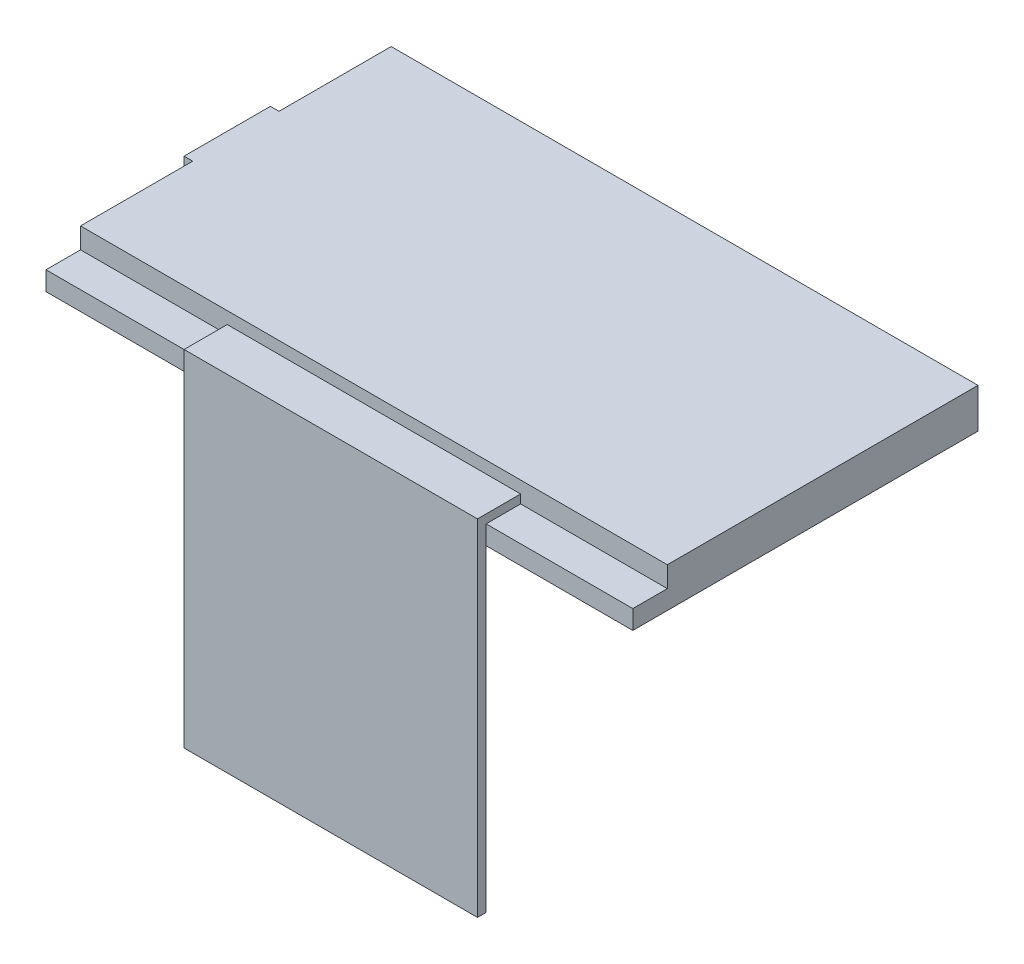
ISO-10303-21;
HEADER;
FILE_DESCRIPTION(('STEP AP214'),'2;1');
FILE_NAME('part.step','',(''),(''),'','','');
FILE_SCHEMA(('AUTOMOTIVE_DESIGN { 1 0 10303 214 1 1 1 1 }'));
ENDSEC;
DATA;
#1=APPLICATION_CONTEXT('core data for automotive mechanical design processes');
#2=APPLICATION_PROTOCOL_DEFINITION('international standard','automotive_design',2000,#1);
#3=PRODUCT_CONTEXT('',#1,'mechanical');
#4=PRODUCT('Part','Part','',(#3));
#5=PRODUCT_RELATED_PRODUCT_CATEGORY('part','',(#4));
#6=PRODUCT_DEFINITION_FORMATION('','',#4);
#7=PRODUCT_DEFINITION_CONTEXT('part definition',#1,'design');
#8=PRODUCT_DEFINITION('design','',#6,#7);
#9=PRODUCT_DEFINITION_SHAPE('','',#8);
#10=(LENGTH_UNIT() NAMED_UNIT(*) SI_UNIT(.MILLI.,.METRE.));
#11=(NAMED_UNIT(*) PLANE_ANGLE_UNIT() SI_UNIT($,.RADIAN.));
#12=(NAMED_UNIT(*) SI_UNIT($,.STERADIAN.) SOLID_ANGLE_UNIT());
#13=UNCERTAINTY_MEASURE_WITH_UNIT(LENGTH_MEASURE(1.E-05),#10,'distance_accuracy_value','');
#14=(GEOMETRIC_REPRESENTATION_CONTEXT(3) GLOBAL_UNCERTAINTY_ASSIGNED_CONTEXT((#13)) GLOBAL_UNIT_ASSIGNED_CONTEXT((#10,
#11,#12)) REPRESENTATION_CONTEXT('',''));
#15=CARTESIAN_POINT('',(0.,0.,0.));
#16=DIRECTION('',(0.,0.,1.));
#17=DIRECTION('',(1.,0.,0.));
#18=AXIS2_PLACEMENT_3D('',#15,#16,#17);
#19=CARTESIAN_POINT('',(-17.,1.1,10.));
#20=DIRECTION('',(0.,0.,-1.));
#21=DIRECTION('',(-1.,0.,0.));
#22=AXIS2_PLACEMENT_3D('',#19,#20,#21);
#23=PLANE('',#22);
#24=DIRECTION('',(0.,1.,0.));
#25=VECTOR('',#24,1.);
#26=CARTESIAN_POINT('',(8.5,-18.4,10.));
#27=LINE('',#26,#25);
#28=CARTESIAN_POINT('',(8.5,0.,10.));
#29=VERTEX_POINT('',#28);
#30=CARTESIAN_POINT('',(8.5,1.1,10.));
#31=VERTEX_POINT('',#30);
#32=EDGE_CURVE('E11',#29,#31,#27,.T.);
#33=ORIENTED_EDGE('',*,*,#32,.F.);
#34=DIRECTION('',(1.,0.,0.));
#35=VECTOR('',#34,1.);
#36=CARTESIAN_POINT('',(-17.,0.,10.));
#37=LINE('',#36,#35);
#38=CARTESIAN_POINT('',(17.,0.,10.));
#39=VERTEX_POINT('',#38);
#40=EDGE_CURVE('E276',#29,#39,#37,.T.);
#41=ORIENTED_EDGE('',*,*,#40,.T.);
#42=DIRECTION('',(0.,-1.,0.));
#43=VECTOR('',#42,1.);
#44=CARTESIAN_POINT('',(17.,1.1,10.));
#45=LINE('',#44,#43);
#46=CARTESIAN_POINT('',(17.,1.1,10.));
#47=VERTEX_POINT('',#46);
#48=EDGE_CURVE('E268',#47,#39,#45,.T.);
#49=ORIENTED_EDGE('',*,*,#48,.F.);
#50=DIRECTION('',(1.,0.,0.));
#51=VECTOR('',#50,1.);
#52=CARTESIAN_POINT('',(-17.,1.1,10.));
#53=LINE('',#52,#51);
#54=EDGE_CURVE('E264',#31,#47,#53,.T.);
#55=ORIENTED_EDGE('',*,*,#54,.F.);
#56=EDGE_LOOP('',(#33,#41,#49,#55));
#57=FACE_BOUND('',#56,.T.);
#58=ADVANCED_FACE('F32',(#57),#23,.F.);
#59=CARTESIAN_POINT('',(0.,1.1,0.));
#60=DIRECTION('',(0.,-1.,0.));
#61=DIRECTION('',(0.,0.,-1.));
#62=AXIS2_PLACEMENT_3D('',#59,#60,#61);
#63=PLANE('',#62);
#64=DIRECTION('',(0.,0.,1.));
#65=VECTOR('',#64,1.);
#66=CARTESIAN_POINT('',(-8.5,1.1,10.));
#67=LINE('',#66,#65);
#68=CARTESIAN_POINT('',(-8.5,1.1,8.));
#69=VERTEX_POINT('',#68);
#70=CARTESIAN_POINT('',(-8.5,1.1,10.));
#71=VERTEX_POINT('',#70);
#72=EDGE_CURVE('E187',#69,#71,#67,.T.);
#73=ORIENTED_EDGE('',*,*,#72,.F.);
#74=DIRECTION('',(1.,0.,0.));
#75=VECTOR('',#74,1.);
#76=CARTESIAN_POINT('',(-17.,1.1,8.));
#77=LINE('',#76,#75);
#78=CARTESIAN_POINT('',(-17.,1.1,8.));
#79=VERTEX_POINT('',#78);
#80=EDGE_CURVE('E249',#79,#69,#77,.T.);
#81=ORIENTED_EDGE('',*,*,#80,.F.);
#82=DIRECTION('',(0.,0.,1.));
#83=VECTOR('',#82,1.);
#84=CARTESIAN_POINT('',(-17.,1.1,10.));
#85=LINE('',#84,#83);
#86=CARTESIAN_POINT('',(-17.,1.1,10.));
#87=VERTEX_POINT('',#86);
#88=EDGE_CURVE('E261',#79,#87,#85,.T.);
#89=ORIENTED_EDGE('',*,*,#88,.T.);
#90=EDGE_CURVE('E265',#87,#71,#53,.T.);
#91=ORIENTED_EDGE('',*,*,#90,.T.);
#92=EDGE_LOOP('',(#73,#81,#89,#91));
#93=FACE_BOUND('',#92,.T.);
#94=ADVANCED_FACE('F307',(#93),#63,.F.);
#95=DIRECTION('',(0.,0.,-1.));
#96=VECTOR('',#95,1.);
#97=CARTESIAN_POINT('',(8.5,1.1,10.));
#98=LINE('',#97,#96);
#99=CARTESIAN_POINT('',(8.5,1.1,8.));
#100=VERTEX_POINT('',#99);
#101=EDGE_CURVE('E194',#31,#100,#98,.T.);
#102=ORIENTED_EDGE('',*,*,#101,.F.);
#103=ORIENTED_EDGE('',*,*,#54,.T.);
#104=DIRECTION('',(0.,0.,-1.));
#105=VECTOR('',#104,1.);
#106=CARTESIAN_POINT('',(17.,1.1,10.));
#107=LINE('',#106,#105);
#108=CARTESIAN_POINT('',(17.,1.1,8.));
#109=VERTEX_POINT('',#108);
#110=EDGE_CURVE('E258',#47,#109,#107,.T.);
#111=ORIENTED_EDGE('',*,*,#110,.T.);
#112=EDGE_CURVE('E235',#100,#109,#77,.T.);
#113=ORIENTED_EDGE('',*,*,#112,.F.);
#114=EDGE_LOOP('',(#102,#103,#111,#113));
#115=FACE_BOUND('',#114,.T.);
#116=ADVANCED_FACE('F337',(#115),#63,.F.);
#117=CARTESIAN_POINT('',(-17.,2.3,8.));
#118=DIRECTION('',(0.,0.,-1.));
#119=DIRECTION('',(-1.,0.,0.));
#120=AXIS2_PLACEMENT_3D('',#117,#118,#119);
#121=PLANE('',#120);
#122=DIRECTION('',(0.,-1.,0.));
#123=VECTOR('',#122,1.);
#124=CARTESIAN_POINT('',(-8.5,1.6,8.));
#125=LINE('',#124,#123);
#126=CARTESIAN_POINT('',(-8.5,1.6,8.));
#127=VERTEX_POINT('',#126);
#128=EDGE_CURVE('E200',#127,#69,#125,.T.);
#129=ORIENTED_EDGE('',*,*,#128,.F.);
#130=DIRECTION('',(-1.,0.,0.));
#131=VECTOR('',#130,1.);
#132=CARTESIAN_POINT('',(-8.5,1.6,8.));
#133=LINE('',#132,#131);
#134=CARTESIAN_POINT('',(8.5,1.6,8.));
#135=VERTEX_POINT('',#134);
#136=EDGE_CURVE('E197',#135,#127,#133,.T.);
#137=ORIENTED_EDGE('',*,*,#136,.F.);
#138=DIRECTION('',(0.,-1.,0.));
#139=VECTOR('',#138,1.);
#140=CARTESIAN_POINT('',(8.5,1.6,7.99999999999999));
#141=LINE('',#140,#139);
#142=EDGE_CURVE('E206',#135,#100,#141,.T.);
#143=ORIENTED_EDGE('',*,*,#142,.T.);
#144=ORIENTED_EDGE('',*,*,#112,.T.);
#145=DIRECTION('',(0.,-1.,0.));
#146=VECTOR('',#145,1.);
#147=CARTESIAN_POINT('',(17.,2.3,8.));
#148=LINE('',#147,#146);
#149=CARTESIAN_POINT('',(17.,2.3,8.));
#150=VERTEX_POINT('',#149);
#151=EDGE_CURVE('E248',#150,#109,#148,.T.);
#152=ORIENTED_EDGE('',*,*,#151,.F.);
#153=DIRECTION('',(1.,0.,0.));
#154=VECTOR('',#153,1.);
#155=CARTESIAN_POINT('',(-17.,2.3,8.));
#156=LINE('',#155,#154);
#157=CARTESIAN_POINT('',(-17.,2.3,8.));
#158=VERTEX_POINT('',#157);
#159=EDGE_CURVE('E239',#158,#150,#156,.T.);
#160=ORIENTED_EDGE('',*,*,#159,.F.);
#161=DIRECTION('',(0.,-1.,0.));
#162=VECTOR('',#161,1.);
#163=CARTESIAN_POINT('',(-17.,2.3,8.));
#164=LINE('',#163,#162);
#165=EDGE_CURVE('E254',#158,#79,#164,.T.);
#166=ORIENTED_EDGE('',*,*,#165,.T.);
#167=ORIENTED_EDGE('',*,*,#80,.T.);
#168=EDGE_LOOP('',(#129,#137,#143,#144,#152,#160,#166,#167));
#169=FACE_BOUND('',#168,.T.);
#170=ADVANCED_FACE('F302',(#169),#121,.F.);
#171=CARTESIAN_POINT('',(-17.,1.1,10.));
#172=DIRECTION('',(1.,0.,0.));
#173=DIRECTION('',(0.,0.,-1.));
#174=AXIS2_PLACEMENT_3D('',#171,#172,#173);
#175=PLANE('',#174);
#176=DIRECTION('',(0.,-1.,0.));
#177=VECTOR('',#176,1.);
#178=CARTESIAN_POINT('',(-17.,0.,-3.5));
#179=LINE('',#178,#177);
#180=CARTESIAN_POINT('',(-17.,2.3,-3.5));
#181=VERTEX_POINT('',#180);
#182=CARTESIAN_POINT('',(-17.,0.,-3.5));
#183=VERTEX_POINT('',#182);
#184=EDGE_CURVE('E208',#181,#183,#179,.T.);
#185=ORIENTED_EDGE('',*,*,#184,.F.);
#186=DIRECTION('',(0.,0.,1.));
#187=VECTOR('',#186,1.);
#188=CARTESIAN_POINT('',(-17.,2.3,-10.));
#189=LINE('',#188,#187);
#190=CARTESIAN_POINT('',(-17.,2.3,-10.));
#191=VERTEX_POINT('',#190);
#192=EDGE_CURVE('E236',#191,#181,#189,.T.);
#193=ORIENTED_EDGE('',*,*,#192,.F.);
#194=DIRECTION('',(0.,-1.,0.));
#195=VECTOR('',#194,1.);
#196=CARTESIAN_POINT('',(-17.,1.1,-10.));
#197=LINE('',#196,#195);
#198=CARTESIAN_POINT('',(-17.,0.,-10.));
#199=VERTEX_POINT('',#198);
#200=EDGE_CURVE('E282',#191,#199,#197,.T.);
#201=ORIENTED_EDGE('',*,*,#200,.T.);
#202=DIRECTION('',(0.,0.,1.));
#203=VECTOR('',#202,1.);
#204=CARTESIAN_POINT('',(-17.,0.,10.));
#205=LINE('',#204,#203);
#206=EDGE_CURVE('E274',#199,#183,#205,.T.);
#207=ORIENTED_EDGE('',*,*,#206,.T.);
#208=EDGE_LOOP('',(#185,#193,#201,#207));
#209=FACE_BOUND('',#208,.T.);
#210=ADVANCED_FACE('F327',(#209),#175,.F.);
#211=DIRECTION('',(0.,1.,0.));
#212=VECTOR('',#211,1.);
#213=CARTESIAN_POINT('',(-17.,0.,1.5));
#214=LINE('',#213,#212);
#215=CARTESIAN_POINT('',(-17.,0.,1.5));
#216=VERTEX_POINT('',#215);
#217=CARTESIAN_POINT('',(-17.,2.3,1.5));
#218=VERTEX_POINT('',#217);
#219=EDGE_CURVE('E213',#216,#218,#214,.T.);
#220=ORIENTED_EDGE('',*,*,#219,.F.);
#221=CARTESIAN_POINT('',(-17.,0.,10.));
#222=VERTEX_POINT('',#221);
#223=EDGE_CURVE('E273',#216,#222,#205,.T.);
#224=ORIENTED_EDGE('',*,*,#223,.T.);
#225=DIRECTION('',(0.,-1.,0.));
#226=VECTOR('',#225,1.);
#227=CARTESIAN_POINT('',(-17.,1.1,10.));
#228=LINE('',#227,#226);
#229=EDGE_CURVE('E280',#87,#222,#228,.T.);
#230=ORIENTED_EDGE('',*,*,#229,.F.);
#231=ORIENTED_EDGE('',*,*,#88,.F.);
#232=ORIENTED_EDGE('',*,*,#165,.F.);
#233=EDGE_CURVE('E240',#218,#158,#189,.T.);
#234=ORIENTED_EDGE('',*,*,#233,.F.);
#235=EDGE_LOOP('',(#220,#224,#230,#231,#232,#234));
#236=FACE_BOUND('',#235,.T.);
#237=ADVANCED_FACE('F310',(#236),#175,.F.);
#238=CARTESIAN_POINT('',(17.,1.1,10.));
#239=DIRECTION('',(-1.,0.,0.));
#240=DIRECTION('',(0.,0.,1.));
#241=AXIS2_PLACEMENT_3D('',#238,#239,#240);
#242=PLANE('',#241);
#243=DIRECTION('',(0.,0.,-1.));
#244=VECTOR('',#243,1.);
#245=CARTESIAN_POINT('',(17.,0.,10.));
#246=LINE('',#245,#244);
#247=CARTESIAN_POINT('',(17.,0.,-10.));
#248=VERTEX_POINT('',#247);
#249=EDGE_CURVE('E257',#39,#248,#246,.T.);
#250=ORIENTED_EDGE('',*,*,#249,.T.);
#251=DIRECTION('',(0.,-1.,0.));
#252=VECTOR('',#251,1.);
#253=CARTESIAN_POINT('',(17.,1.1,-10.));
#254=LINE('',#253,#252);
#255=CARTESIAN_POINT('',(17.,2.3,-10.));
#256=VERTEX_POINT('',#255);
#257=EDGE_CURVE('E36',#256,#248,#254,.T.);
#258=ORIENTED_EDGE('',*,*,#257,.F.);
#259=DIRECTION('',(0.,0.,-1.));
#260=VECTOR('',#259,1.);
#261=CARTESIAN_POINT('',(17.,2.3,-10.));
#262=LINE('',#261,#260);
#263=EDGE_CURVE('E242',#150,#256,#262,.T.);
#264=ORIENTED_EDGE('',*,*,#263,.F.);
#265=ORIENTED_EDGE('',*,*,#151,.T.);
#266=ORIENTED_EDGE('',*,*,#110,.F.);
#267=ORIENTED_EDGE('',*,*,#48,.T.);
#268=EDGE_LOOP('',(#250,#258,#264,#265,#266,#267));
#269=FACE_BOUND('',#268,.T.);
#270=ADVANCED_FACE('F34',(#269),#242,.F.);
#271=CARTESIAN_POINT('',(-17.,1.1,-10.));
#272=DIRECTION('',(0.,0.,1.));
#273=DIRECTION('',(1.,0.,0.));
#274=AXIS2_PLACEMENT_3D('',#271,#272,#273);
#275=PLANE('',#274);
#276=DIRECTION('',(-1.,0.,0.));
#277=VECTOR('',#276,1.);
#278=CARTESIAN_POINT('',(-17.,0.,-10.));
#279=LINE('',#278,#277);
#280=EDGE_CURVE('E271',#248,#199,#279,.T.);
#281=ORIENTED_EDGE('',*,*,#280,.T.);
#282=ORIENTED_EDGE('',*,*,#200,.F.);
#283=DIRECTION('',(-1.,0.,0.));
#284=VECTOR('',#283,1.);
#285=CARTESIAN_POINT('',(-17.,2.3,-10.));
#286=LINE('',#285,#284);
#287=EDGE_CURVE('E245',#256,#191,#286,.T.);
#288=ORIENTED_EDGE('',*,*,#287,.F.);
#289=ORIENTED_EDGE('',*,*,#257,.T.);
#290=EDGE_LOOP('',(#281,#282,#288,#289));
#291=FACE_BOUND('',#290,.T.);
#292=ADVANCED_FACE('F331',(#291),#275,.F.);
#293=CARTESIAN_POINT('',(-8.5,0.,10.));
#294=VERTEX_POINT('',#293);
#295=EDGE_CURVE('E262',#222,#294,#37,.T.);
#296=ORIENTED_EDGE('',*,*,#295,.T.);
#297=DIRECTION('',(0.,1.,0.));
#298=VECTOR('',#297,1.);
#299=CARTESIAN_POINT('',(-8.5,-18.4,10.));
#300=LINE('',#299,#298);
#301=EDGE_CURVE('E41',#294,#71,#300,.T.);
#302=ORIENTED_EDGE('',*,*,#301,.T.);
#303=ORIENTED_EDGE('',*,*,#90,.F.);
#304=ORIENTED_EDGE('',*,*,#229,.T.);
#305=EDGE_LOOP('',(#296,#302,#303,#304));
#306=FACE_BOUND('',#305,.T.);
#307=ADVANCED_FACE('F293',(#306),#23,.F.);
#308=CARTESIAN_POINT('',(0.,0.,0.));
#309=DIRECTION('',(0.,-1.,0.));
#310=DIRECTION('',(0.,0.,-1.));
#311=AXIS2_PLACEMENT_3D('',#308,#309,#310);
#312=PLANE('',#311);
#313=ORIENTED_EDGE('',*,*,#249,.F.);
#314=ORIENTED_EDGE('',*,*,#40,.F.);
#315=EDGE_CURVE('E55',#294,#29,#37,.T.);
#316=ORIENTED_EDGE('',*,*,#315,.F.);
#317=ORIENTED_EDGE('',*,*,#295,.F.);
#318=ORIENTED_EDGE('',*,*,#223,.F.);
#319=DIRECTION('',(1.,0.,0.));
#320=VECTOR('',#319,1.);
#321=CARTESIAN_POINT('',(-17.5,0.,1.5));
#322=LINE('',#321,#320);
#323=CARTESIAN_POINT('',(-17.5,0.,1.5));
#324=VERTEX_POINT('',#323);
#325=EDGE_CURVE('E229',#324,#216,#322,.T.);
#326=ORIENTED_EDGE('',*,*,#325,.F.);
#327=DIRECTION('',(0.,0.,1.));
#328=VECTOR('',#327,1.);
#329=CARTESIAN_POINT('',(-17.5,0.,-3.5));
#330=LINE('',#329,#328);
#331=CARTESIAN_POINT('',(-17.5,0.,-3.5));
#332=VERTEX_POINT('',#331);
#333=EDGE_CURVE('E212',#332,#324,#330,.T.);
#334=ORIENTED_EDGE('',*,*,#333,.F.);
#335=DIRECTION('',(1.,0.,0.));
#336=VECTOR('',#335,1.);
#337=CARTESIAN_POINT('',(-17.5,0.,-3.5));
#338=LINE('',#337,#336);
#339=EDGE_CURVE('E232',#332,#183,#338,.T.);
#340=ORIENTED_EDGE('',*,*,#339,.T.);
#341=ORIENTED_EDGE('',*,*,#206,.F.);
#342=ORIENTED_EDGE('',*,*,#280,.F.);
#343=EDGE_LOOP('',(#313,#314,#316,#317,#318,#326,#334,#340,#341,#342));
#344=FACE_BOUND('',#343,.T.);
#345=ADVANCED_FACE('F313',(#344),#312,.T.);
#346=CARTESIAN_POINT('',(0.,2.3,0.));
#347=DIRECTION('',(0.,1.,0.));
#348=DIRECTION('',(0.,0.,1.));
#349=AXIS2_PLACEMENT_3D('',#346,#347,#348);
#350=PLANE('',#349);
#351=ORIENTED_EDGE('',*,*,#192,.T.);
#352=DIRECTION('',(1.,0.,0.));
#353=VECTOR('',#352,1.);
#354=CARTESIAN_POINT('',(-17.5,2.3,-3.5));
#355=LINE('',#354,#353);
#356=CARTESIAN_POINT('',(-17.5,2.3,-3.5));
#357=VERTEX_POINT('',#356);
#358=EDGE_CURVE('E219',#357,#181,#355,.T.);
#359=ORIENTED_EDGE('',*,*,#358,.F.);
#360=DIRECTION('',(0.,0.,-1.));
#361=VECTOR('',#360,1.);
#362=CARTESIAN_POINT('',(-17.5,2.3,-3.5));
#363=LINE('',#362,#361);
#364=CARTESIAN_POINT('',(-17.5,2.3,1.5));
#365=VERTEX_POINT('',#364);
#366=EDGE_CURVE('E217',#365,#357,#363,.T.);
#367=ORIENTED_EDGE('',*,*,#366,.F.);
#368=DIRECTION('',(1.,0.,0.));
#369=VECTOR('',#368,1.);
#370=CARTESIAN_POINT('',(-17.5,2.3,1.5));
#371=LINE('',#370,#369);
#372=EDGE_CURVE('E226',#365,#218,#371,.T.);
#373=ORIENTED_EDGE('',*,*,#372,.T.);
#374=ORIENTED_EDGE('',*,*,#233,.T.);
#375=ORIENTED_EDGE('',*,*,#159,.T.);
#376=ORIENTED_EDGE('',*,*,#263,.T.);
#377=ORIENTED_EDGE('',*,*,#287,.T.);
#378=EDGE_LOOP('',(#351,#359,#367,#373,#374,#375,#376,#377));
#379=FACE_BOUND('',#378,.T.);
#380=ADVANCED_FACE('F329',(#379),#350,.T.);
#381=CARTESIAN_POINT('',(-17.5,0.,-3.5));
#382=DIRECTION('',(0.,0.,1.));
#383=DIRECTION('',(1.,0.,0.));
#384=AXIS2_PLACEMENT_3D('',#381,#382,#383);
#385=PLANE('',#384);
#386=ORIENTED_EDGE('',*,*,#184,.T.);
#387=ORIENTED_EDGE('',*,*,#339,.F.);
#388=DIRECTION('',(0.,-1.,0.));
#389=VECTOR('',#388,1.);
#390=CARTESIAN_POINT('',(-17.5,0.,-3.5));
#391=LINE('',#390,#389);
#392=EDGE_CURVE('E209',#357,#332,#391,.T.);
#393=ORIENTED_EDGE('',*,*,#392,.F.);
#394=ORIENTED_EDGE('',*,*,#358,.T.);
#395=EDGE_LOOP('',(#386,#387,#393,#394));
#396=FACE_BOUND('',#395,.T.);
#397=ADVANCED_FACE('F326',(#396),#385,.F.);
#398=CARTESIAN_POINT('',(-17.5,0.,1.5));
#399=DIRECTION('',(0.,0.,-1.));
#400=DIRECTION('',(-1.,0.,0.));
#401=AXIS2_PLACEMENT_3D('',#398,#399,#400);
#402=PLANE('',#401);
#403=ORIENTED_EDGE('',*,*,#219,.T.);
#404=ORIENTED_EDGE('',*,*,#372,.F.);
#405=DIRECTION('',(0.,1.,0.));
#406=VECTOR('',#405,1.);
#407=CARTESIAN_POINT('',(-17.5,0.,1.5));
#408=LINE('',#407,#406);
#409=EDGE_CURVE('E215',#324,#365,#408,.T.);
#410=ORIENTED_EDGE('',*,*,#409,.F.);
#411=ORIENTED_EDGE('',*,*,#325,.T.);
#412=EDGE_LOOP('',(#403,#404,#410,#411));
#413=FACE_BOUND('',#412,.T.);
#414=ADVANCED_FACE('F317',(#413),#402,.F.);
#415=CARTESIAN_POINT('',(-17.5,0.,0.));
#416=DIRECTION('',(1.,0.,0.));
#417=DIRECTION('',(0.,0.,-1.));
#418=AXIS2_PLACEMENT_3D('',#415,#416,#417);
#419=PLANE('',#418);
#420=ORIENTED_EDGE('',*,*,#392,.T.);
#421=ORIENTED_EDGE('',*,*,#333,.T.);
#422=ORIENTED_EDGE('',*,*,#409,.T.);
#423=ORIENTED_EDGE('',*,*,#366,.T.);
#424=EDGE_LOOP('',(#420,#421,#422,#423));
#425=FACE_BOUND('',#424,.T.);
#426=ADVANCED_FACE('F321',(#425),#419,.F.);
#427=CARTESIAN_POINT('',(-8.5,1.6,10.));
#428=DIRECTION('',(1.,0.,0.));
#429=DIRECTION('',(0.,0.,-1.));
#430=AXIS2_PLACEMENT_3D('',#427,#428,#429);
#431=PLANE('',#430);
#432=ORIENTED_EDGE('',*,*,#72,.T.);
#433=ORIENTED_EDGE('',*,*,#301,.F.);
#434=CARTESIAN_POINT('',(-8.5,-18.4,10.));
#435=VERTEX_POINT('',#434);
#436=EDGE_CURVE('E181',#435,#294,#300,.T.);
#437=ORIENTED_EDGE('',*,*,#436,.F.);
#438=DIRECTION('',(0.,0.,1.));
#439=VECTOR('',#438,1.);
#440=CARTESIAN_POINT('',(-8.5,-18.4,10.));
#441=LINE('',#440,#439);
#442=CARTESIAN_POINT('',(-8.5,-18.4,10.5));
#443=VERTEX_POINT('',#442);
#444=EDGE_CURVE('E173',#435,#443,#441,.T.);
#445=ORIENTED_EDGE('',*,*,#444,.T.);
#446=DIRECTION('',(0.,1.,0.));
#447=VECTOR('',#446,1.);
#448=CARTESIAN_POINT('',(-8.5,-18.4,10.5));
#449=LINE('',#448,#447);
#450=CARTESIAN_POINT('',(-8.5,1.6,10.5));
#451=VERTEX_POINT('',#450);
#452=EDGE_CURVE('E155',#443,#451,#449,.T.);
#453=ORIENTED_EDGE('',*,*,#452,.T.);
#454=DIRECTION('',(0.,0.,1.));
#455=VECTOR('',#454,1.);
#456=CARTESIAN_POINT('',(-8.5,1.6,10.));
#457=LINE('',#456,#455);
#458=EDGE_CURVE('E191',#127,#451,#457,.T.);
#459=ORIENTED_EDGE('',*,*,#458,.F.);
#460=ORIENTED_EDGE('',*,*,#128,.T.);
#461=EDGE_LOOP('',(#432,#433,#437,#445,#453,#459,#460));
#462=FACE_BOUND('',#461,.T.);
#463=ADVANCED_FACE('F178',(#462),#431,.F.);
#464=CARTESIAN_POINT('',(8.5,1.6,10.));
#465=DIRECTION('',(-1.,0.,0.));
#466=DIRECTION('',(0.,0.,1.));
#467=AXIS2_PLACEMENT_3D('',#464,#465,#466);
#468=PLANE('',#467);
#469=ORIENTED_EDGE('',*,*,#101,.T.);
#470=ORIENTED_EDGE('',*,*,#142,.F.);
#471=DIRECTION('',(0.,0.,-1.));
#472=VECTOR('',#471,1.);
#473=CARTESIAN_POINT('',(8.5,1.6,10.));
#474=LINE('',#473,#472);
#475=CARTESIAN_POINT('',(8.5,1.6,10.5));
#476=VERTEX_POINT('',#475);
#477=EDGE_CURVE('E193',#476,#135,#474,.T.);
#478=ORIENTED_EDGE('',*,*,#477,.F.);
#479=DIRECTION('',(0.,1.,0.));
#480=VECTOR('',#479,1.);
#481=CARTESIAN_POINT('',(8.5,-18.4,10.5));
#482=LINE('',#481,#480);
#483=CARTESIAN_POINT('',(8.5,-18.4,10.5));
#484=VERTEX_POINT('',#483);
#485=EDGE_CURVE('E165',#484,#476,#482,.T.);
#486=ORIENTED_EDGE('',*,*,#485,.F.);
#487=DIRECTION('',(0.,0.,-1.));
#488=VECTOR('',#487,1.);
#489=CARTESIAN_POINT('',(8.5,-18.4,10.));
#490=LINE('',#489,#488);
#491=CARTESIAN_POINT('',(8.5,-18.4,10.));
#492=VERTEX_POINT('',#491);
#493=EDGE_CURVE('E176',#484,#492,#490,.T.);
#494=ORIENTED_EDGE('',*,*,#493,.T.);
#495=EDGE_CURVE('E43',#492,#29,#27,.T.);
#496=ORIENTED_EDGE('',*,*,#495,.T.);
#497=ORIENTED_EDGE('',*,*,#32,.T.);
#498=EDGE_LOOP('',(#469,#470,#478,#486,#494,#496,#497));
#499=FACE_BOUND('',#498,.T.);
#500=ADVANCED_FACE('F297',(#499),#468,.F.);
#501=CARTESIAN_POINT('',(0.,1.6,0.));
#502=DIRECTION('',(0.,-1.,0.));
#503=DIRECTION('',(0.,0.,-1.));
#504=AXIS2_PLACEMENT_3D('',#501,#502,#503);
#505=PLANE('',#504);
#506=ORIENTED_EDGE('',*,*,#458,.T.);
#507=DIRECTION('',(1.,0.,0.));
#508=VECTOR('',#507,1.);
#509=CARTESIAN_POINT('',(-8.5,1.6,10.5));
#510=LINE('',#509,#508);
#511=EDGE_CURVE('E161',#451,#476,#510,.T.);
#512=ORIENTED_EDGE('',*,*,#511,.T.);
#513=ORIENTED_EDGE('',*,*,#477,.T.);
#514=ORIENTED_EDGE('',*,*,#136,.T.);
#515=EDGE_LOOP('',(#506,#512,#513,#514));
#516=FACE_BOUND('',#515,.T.);
#517=ADVANCED_FACE('F300',(#516),#505,.F.);
#518=CARTESIAN_POINT('',(-8.5,-18.4,10.));
#519=DIRECTION('',(0.,0.,-1.));
#520=DIRECTION('',(-1.,0.,0.));
#521=AXIS2_PLACEMENT_3D('',#518,#519,#520);
#522=PLANE('',#521);
#523=ORIENTED_EDGE('',*,*,#436,.T.);
#524=ORIENTED_EDGE('',*,*,#315,.T.);
#525=ORIENTED_EDGE('',*,*,#495,.F.);
#526=DIRECTION('',(-1.,0.,0.));
#527=VECTOR('',#526,1.);
#528=CARTESIAN_POINT('',(-8.5,-18.4,10.));
#529=LINE('',#528,#527);
#530=EDGE_CURVE('E166',#492,#435,#529,.T.);
#531=ORIENTED_EDGE('',*,*,#530,.T.);
#532=EDGE_LOOP('',(#523,#524,#525,#531));
#533=FACE_BOUND('',#532,.T.);
#534=ADVANCED_FACE('F295',(#533),#522,.T.);
#535=CARTESIAN_POINT('',(-8.5,-18.4,10.5));
#536=DIRECTION('',(0.,0.,1.));
#537=DIRECTION('',(1.,0.,0.));
#538=AXIS2_PLACEMENT_3D('',#535,#536,#537);
#539=PLANE('',#538);
#540=ORIENTED_EDGE('',*,*,#511,.F.);
#541=ORIENTED_EDGE('',*,*,#452,.F.);
#542=DIRECTION('',(1.,0.,0.));
#543=VECTOR('',#542,1.);
#544=CARTESIAN_POINT('',(-8.5,-18.4,10.5));
#545=LINE('',#544,#543);
#546=EDGE_CURVE('E159',#443,#484,#545,.T.);
#547=ORIENTED_EDGE('',*,*,#546,.T.);
#548=ORIENTED_EDGE('',*,*,#485,.T.);
#549=EDGE_LOOP('',(#540,#541,#547,#548));
#550=FACE_BOUND('',#549,.T.);
#551=ADVANCED_FACE('F157',(#550),#539,.T.);
#552=CARTESIAN_POINT('',(0.,-18.4,0.));
#553=DIRECTION('',(0.,1.,0.));
#554=DIRECTION('',(0.,0.,1.));
#555=AXIS2_PLACEMENT_3D('',#552,#553,#554);
#556=PLANE('',#555);
#557=ORIENTED_EDGE('',*,*,#444,.F.);
#558=ORIENTED_EDGE('',*,*,#530,.F.);
#559=ORIENTED_EDGE('',*,*,#493,.F.);
#560=ORIENTED_EDGE('',*,*,#546,.F.);
#561=EDGE_LOOP('',(#557,#558,#559,#560));
#562=FACE_BOUND('',#561,.T.);
#563=ADVANCED_FACE('F171',(#562),#556,.F.);
#564=CLOSED_SHELL('',(#58,#94,#116,#170,#210,#237,#270,#292,#307,#345,#380,#397,#414,#426,#463,
#500,#517,#534,#551,#563));
#565=MANIFOLD_SOLID_BREP('B2',#564);
#566=ADVANCED_BREP_SHAPE_REPRESENTATION('',(#18,#565),#14);
#567=SHAPE_DEFINITION_REPRESENTATION(#9,#566);
ENDSEC;
END-ISO-10303-21;
